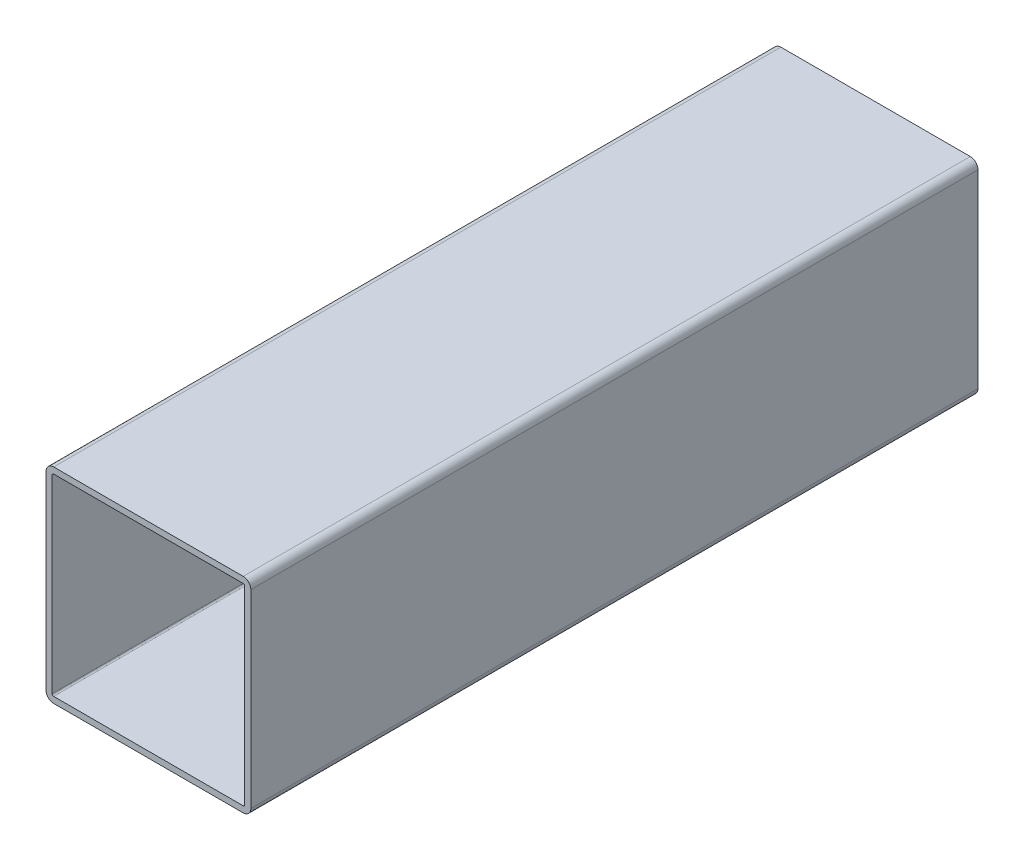
ISO-10303-21;
HEADER;
FILE_DESCRIPTION(('STEP AP214'),'2;1');
FILE_NAME('part.step','',(''),(''),'','','');
FILE_SCHEMA(('AUTOMOTIVE_DESIGN { 1 0 10303 214 1 1 1 1 }'));
ENDSEC;
DATA;
#1=APPLICATION_CONTEXT('core data for automotive mechanical design processes');
#2=APPLICATION_PROTOCOL_DEFINITION('international standard','automotive_design',2000,#1);
#3=PRODUCT_CONTEXT('',#1,'mechanical');
#4=PRODUCT('Part','Part','',(#3));
#5=PRODUCT_RELATED_PRODUCT_CATEGORY('part','',(#4));
#6=PRODUCT_DEFINITION_FORMATION('','',#4);
#7=PRODUCT_DEFINITION_CONTEXT('part definition',#1,'design');
#8=PRODUCT_DEFINITION('design','',#6,#7);
#9=PRODUCT_DEFINITION_SHAPE('','',#8);
#10=(LENGTH_UNIT() NAMED_UNIT(*) SI_UNIT(.MILLI.,.METRE.));
#11=(NAMED_UNIT(*) PLANE_ANGLE_UNIT() SI_UNIT($,.RADIAN.));
#12=(NAMED_UNIT(*) SI_UNIT($,.STERADIAN.) SOLID_ANGLE_UNIT());
#13=UNCERTAINTY_MEASURE_WITH_UNIT(LENGTH_MEASURE(1.E-05),#10,'distance_accuracy_value','');
#14=(GEOMETRIC_REPRESENTATION_CONTEXT(3) GLOBAL_UNCERTAINTY_ASSIGNED_CONTEXT((#13)) GLOBAL_UNIT_ASSIGNED_CONTEXT((#10,
#11,#12)) REPRESENTATION_CONTEXT('',''));
#15=CARTESIAN_POINT('',(0.,0.,0.));
#16=DIRECTION('',(0.,0.,1.));
#17=DIRECTION('',(1.,0.,0.));
#18=AXIS2_PLACEMENT_3D('',#15,#16,#17);
#19=CARTESIAN_POINT('',(-18.5,18.5,-142.));
#20=DIRECTION('',(0.,0.,1.));
#21=DIRECTION('',(1.,0.,0.));
#22=AXIS2_PLACEMENT_3D('',#19,#20,#21);
#23=CYLINDRICAL_SURFACE('',#22,1.5);
#24=CARTESIAN_POINT('',(-18.5,18.5,0.));
#25=DIRECTION('',(0.,0.,-1.));
#26=DIRECTION('',(-1.,0.,0.));
#27=AXIS2_PLACEMENT_3D('',#24,#25,#26);
#28=CIRCLE('',#27,1.5);
#29=CARTESIAN_POINT('',(-20.,18.5,0.));
#30=VERTEX_POINT('',#29);
#31=CARTESIAN_POINT('',(-18.5,20.,0.));
#32=VERTEX_POINT('',#31);
#33=EDGE_CURVE('E233',#30,#32,#28,.T.);
#34=ORIENTED_EDGE('',*,*,#33,.T.);
#35=DIRECTION('',(0.,0.,1.));
#36=VECTOR('',#35,1.);
#37=CARTESIAN_POINT('',(-18.5,20.,-142.));
#38=LINE('',#37,#36);
#39=CARTESIAN_POINT('',(-18.5,20.,-142.));
#40=VERTEX_POINT('',#39);
#41=EDGE_CURVE('E12',#40,#32,#38,.T.);
#42=ORIENTED_EDGE('',*,*,#41,.F.);
#43=CARTESIAN_POINT('',(-18.5,18.5,-142.));
#44=DIRECTION('',(0.,0.,-1.));
#45=DIRECTION('',(-1.,0.,0.));
#46=AXIS2_PLACEMENT_3D('',#43,#44,#45);
#47=CIRCLE('',#46,1.5);
#48=CARTESIAN_POINT('',(-20.,18.5,-142.));
#49=VERTEX_POINT('',#48);
#50=EDGE_CURVE('E311',#49,#40,#47,.T.);
#51=ORIENTED_EDGE('',*,*,#50,.F.);
#52=DIRECTION('',(0.,0.,1.));
#53=VECTOR('',#52,1.);
#54=CARTESIAN_POINT('',(-20.,18.5,-142.));
#55=LINE('',#54,#53);
#56=EDGE_CURVE('E248',#49,#30,#55,.T.);
#57=ORIENTED_EDGE('',*,*,#56,.T.);
#58=EDGE_LOOP('',(#34,#42,#51,#57));
#59=FACE_BOUND('',#58,.T.);
#60=ADVANCED_FACE('F61',(#59),#23,.T.);
#61=CARTESIAN_POINT('',(-18.5,20.,-142.));
#62=DIRECTION('',(0.,-1.,0.));
#63=DIRECTION('',(0.,0.,-1.));
#64=AXIS2_PLACEMENT_3D('',#61,#62,#63);
#65=PLANE('',#64);
#66=DIRECTION('',(1.,0.,0.));
#67=VECTOR('',#66,1.);
#68=CARTESIAN_POINT('',(-18.5,20.,0.));
#69=LINE('',#68,#67);
#70=CARTESIAN_POINT('',(18.5,20.,0.));
#71=VERTEX_POINT('',#70);
#72=EDGE_CURVE('E236',#32,#71,#69,.T.);
#73=ORIENTED_EDGE('',*,*,#72,.T.);
#74=DIRECTION('',(0.,0.,1.));
#75=VECTOR('',#74,1.);
#76=CARTESIAN_POINT('',(18.5,20.,-142.));
#77=LINE('',#76,#75);
#78=CARTESIAN_POINT('',(18.5,20.,-142.));
#79=VERTEX_POINT('',#78);
#80=EDGE_CURVE('E71',#79,#71,#77,.T.);
#81=ORIENTED_EDGE('',*,*,#80,.F.);
#82=DIRECTION('',(1.,0.,0.));
#83=VECTOR('',#82,1.);
#84=CARTESIAN_POINT('',(-18.5,20.,-142.));
#85=LINE('',#84,#83);
#86=EDGE_CURVE('E313',#40,#79,#85,.T.);
#87=ORIENTED_EDGE('',*,*,#86,.F.);
#88=ORIENTED_EDGE('',*,*,#41,.T.);
#89=EDGE_LOOP('',(#73,#81,#87,#88));
#90=FACE_BOUND('',#89,.T.);
#91=ADVANCED_FACE('F348',(#90),#65,.F.);
#92=CARTESIAN_POINT('',(18.5,18.5,-142.));
#93=DIRECTION('',(0.,0.,1.));
#94=DIRECTION('',(1.,0.,0.));
#95=AXIS2_PLACEMENT_3D('',#92,#93,#94);
#96=CYLINDRICAL_SURFACE('',#95,1.5);
#97=CARTESIAN_POINT('',(18.5,18.5,0.));
#98=DIRECTION('',(0.,0.,-1.));
#99=DIRECTION('',(-1.,0.,0.));
#100=AXIS2_PLACEMENT_3D('',#97,#98,#99);
#101=CIRCLE('',#100,1.5);
#102=CARTESIAN_POINT('',(20.,18.5,0.));
#103=VERTEX_POINT('',#102);
#104=EDGE_CURVE('E238',#71,#103,#101,.T.);
#105=ORIENTED_EDGE('',*,*,#104,.T.);
#106=DIRECTION('',(0.,0.,1.));
#107=VECTOR('',#106,1.);
#108=CARTESIAN_POINT('',(20.,18.5,-142.));
#109=LINE('',#108,#107);
#110=CARTESIAN_POINT('',(20.,18.5,-142.));
#111=VERTEX_POINT('',#110);
#112=EDGE_CURVE('E255',#111,#103,#109,.T.);
#113=ORIENTED_EDGE('',*,*,#112,.F.);
#114=CARTESIAN_POINT('',(18.5,18.5,-142.));
#115=DIRECTION('',(0.,0.,-1.));
#116=DIRECTION('',(-1.,0.,0.));
#117=AXIS2_PLACEMENT_3D('',#114,#115,#116);
#118=CIRCLE('',#117,1.5);
#119=EDGE_CURVE('E315',#79,#111,#118,.T.);
#120=ORIENTED_EDGE('',*,*,#119,.F.);
#121=ORIENTED_EDGE('',*,*,#80,.T.);
#122=EDGE_LOOP('',(#105,#113,#120,#121));
#123=FACE_BOUND('',#122,.T.);
#124=ADVANCED_FACE('F353',(#123),#96,.T.);
#125=CARTESIAN_POINT('',(20.,-18.5,-142.));
#126=DIRECTION('',(-1.,0.,0.));
#127=DIRECTION('',(0.,0.,1.));
#128=AXIS2_PLACEMENT_3D('',#125,#126,#127);
#129=PLANE('',#128);
#130=DIRECTION('',(0.,-1.,0.));
#131=VECTOR('',#130,1.);
#132=CARTESIAN_POINT('',(20.,-18.5,0.));
#133=LINE('',#132,#131);
#134=CARTESIAN_POINT('',(20.,-18.5,0.));
#135=VERTEX_POINT('',#134);
#136=EDGE_CURVE('E240',#103,#135,#133,.T.);
#137=ORIENTED_EDGE('',*,*,#136,.T.);
#138=DIRECTION('',(0.,0.,1.));
#139=VECTOR('',#138,1.);
#140=CARTESIAN_POINT('',(20.,-18.5,-142.));
#141=LINE('',#140,#139);
#142=CARTESIAN_POINT('',(20.,-18.5,-142.));
#143=VERTEX_POINT('',#142);
#144=EDGE_CURVE('E252',#143,#135,#141,.T.);
#145=ORIENTED_EDGE('',*,*,#144,.F.);
#146=DIRECTION('',(0.,-1.,0.));
#147=VECTOR('',#146,1.);
#148=CARTESIAN_POINT('',(20.,-18.5,-142.));
#149=LINE('',#148,#147);
#150=EDGE_CURVE('E317',#111,#143,#149,.T.);
#151=ORIENTED_EDGE('',*,*,#150,.F.);
#152=ORIENTED_EDGE('',*,*,#112,.T.);
#153=EDGE_LOOP('',(#137,#145,#151,#152));
#154=FACE_BOUND('',#153,.T.);
#155=ADVANCED_FACE('F323',(#154),#129,.F.);
#156=CARTESIAN_POINT('',(18.5,-18.5,-142.));
#157=DIRECTION('',(0.,0.,1.));
#158=DIRECTION('',(1.,0.,0.));
#159=AXIS2_PLACEMENT_3D('',#156,#157,#158);
#160=CYLINDRICAL_SURFACE('',#159,1.5);
#161=CARTESIAN_POINT('',(18.5,-18.5,0.));
#162=DIRECTION('',(0.,0.,-1.));
#163=DIRECTION('',(-1.,0.,0.));
#164=AXIS2_PLACEMENT_3D('',#161,#162,#163);
#165=CIRCLE('',#164,1.5);
#166=CARTESIAN_POINT('',(18.5,-20.,0.));
#167=VERTEX_POINT('',#166);
#168=EDGE_CURVE('E242',#135,#167,#165,.T.);
#169=ORIENTED_EDGE('',*,*,#168,.T.);
#170=DIRECTION('',(0.,0.,1.));
#171=VECTOR('',#170,1.);
#172=CARTESIAN_POINT('',(18.5,-20.,-142.));
#173=LINE('',#172,#171);
#174=CARTESIAN_POINT('',(18.5,-20.,-142.));
#175=VERTEX_POINT('',#174);
#176=EDGE_CURVE('E200',#175,#167,#173,.T.);
#177=ORIENTED_EDGE('',*,*,#176,.F.);
#178=CARTESIAN_POINT('',(18.5,-18.5,-142.));
#179=DIRECTION('',(0.,0.,-1.));
#180=DIRECTION('',(-1.,0.,0.));
#181=AXIS2_PLACEMENT_3D('',#178,#179,#180);
#182=CIRCLE('',#181,1.5);
#183=EDGE_CURVE('E191',#143,#175,#182,.T.);
#184=ORIENTED_EDGE('',*,*,#183,.F.);
#185=ORIENTED_EDGE('',*,*,#144,.T.);
#186=EDGE_LOOP('',(#169,#177,#184,#185));
#187=FACE_BOUND('',#186,.T.);
#188=ADVANCED_FACE('F327',(#187),#160,.T.);
#189=CARTESIAN_POINT('',(18.5,-20.,-142.));
#190=DIRECTION('',(0.,1.,0.));
#191=DIRECTION('',(0.,0.,1.));
#192=AXIS2_PLACEMENT_3D('',#189,#190,#191);
#193=PLANE('',#192);
#194=DIRECTION('',(-1.,0.,0.));
#195=VECTOR('',#194,1.);
#196=CARTESIAN_POINT('',(18.5,-20.,0.));
#197=LINE('',#196,#195);
#198=CARTESIAN_POINT('',(-18.5,-20.,0.));
#199=VERTEX_POINT('',#198);
#200=EDGE_CURVE('E199',#167,#199,#197,.T.);
#201=ORIENTED_EDGE('',*,*,#200,.T.);
#202=DIRECTION('',(0.,0.,1.));
#203=VECTOR('',#202,1.);
#204=CARTESIAN_POINT('',(-18.5,-20.,-142.));
#205=LINE('',#204,#203);
#206=CARTESIAN_POINT('',(-18.5,-20.,-142.));
#207=VERTEX_POINT('',#206);
#208=EDGE_CURVE('E196',#207,#199,#205,.T.);
#209=ORIENTED_EDGE('',*,*,#208,.F.);
#210=DIRECTION('',(-1.,0.,0.));
#211=VECTOR('',#210,1.);
#212=CARTESIAN_POINT('',(18.5,-20.,-142.));
#213=LINE('',#212,#211);
#214=EDGE_CURVE('E185',#175,#207,#213,.T.);
#215=ORIENTED_EDGE('',*,*,#214,.F.);
#216=ORIENTED_EDGE('',*,*,#176,.T.);
#217=EDGE_LOOP('',(#201,#209,#215,#216));
#218=FACE_BOUND('',#217,.T.);
#219=ADVANCED_FACE('F197',(#218),#193,.F.);
#220=CARTESIAN_POINT('',(-18.5,-18.5,-142.));
#221=DIRECTION('',(0.,0.,1.));
#222=DIRECTION('',(1.,0.,0.));
#223=AXIS2_PLACEMENT_3D('',#220,#221,#222);
#224=CYLINDRICAL_SURFACE('',#223,1.5);
#225=CARTESIAN_POINT('',(-18.5,-18.5,0.));
#226=DIRECTION('',(0.,0.,-1.));
#227=DIRECTION('',(-1.,0.,0.));
#228=AXIS2_PLACEMENT_3D('',#225,#226,#227);
#229=CIRCLE('',#228,1.5);
#230=CARTESIAN_POINT('',(-20.,-18.5,0.));
#231=VERTEX_POINT('',#230);
#232=EDGE_CURVE('E133',#199,#231,#229,.T.);
#233=ORIENTED_EDGE('',*,*,#232,.T.);
#234=DIRECTION('',(0.,0.,1.));
#235=VECTOR('',#234,1.);
#236=CARTESIAN_POINT('',(-20.,-18.5,-142.));
#237=LINE('',#236,#235);
#238=CARTESIAN_POINT('',(-20.,-18.5,-142.));
#239=VERTEX_POINT('',#238);
#240=EDGE_CURVE('E201',#239,#231,#237,.T.);
#241=ORIENTED_EDGE('',*,*,#240,.F.);
#242=CARTESIAN_POINT('',(-18.5,-18.5,-142.));
#243=DIRECTION('',(0.,0.,-1.));
#244=DIRECTION('',(-1.,0.,0.));
#245=AXIS2_PLACEMENT_3D('',#242,#243,#244);
#246=CIRCLE('',#245,1.5);
#247=EDGE_CURVE('E189',#207,#239,#246,.T.);
#248=ORIENTED_EDGE('',*,*,#247,.F.);
#249=ORIENTED_EDGE('',*,*,#208,.T.);
#250=EDGE_LOOP('',(#233,#241,#248,#249));
#251=FACE_BOUND('',#250,.T.);
#252=ADVANCED_FACE('F203',(#251),#224,.T.);
#253=CARTESIAN_POINT('',(18.5,18.5,-142.));
#254=DIRECTION('',(0.,0.,1.));
#255=DIRECTION('',(1.,0.,0.));
#256=AXIS2_PLACEMENT_3D('',#253,#254,#255);
#257=CYLINDRICAL_SURFACE('',#256,0.3);
#258=CARTESIAN_POINT('',(18.5,18.5,0.));
#259=DIRECTION('',(0.,0.,-1.));
#260=DIRECTION('',(-1.,0.,0.));
#261=AXIS2_PLACEMENT_3D('',#258,#259,#260);
#262=CIRCLE('',#261,0.3);
#263=CARTESIAN_POINT('',(18.5,18.8,0.));
#264=VERTEX_POINT('',#263);
#265=CARTESIAN_POINT('',(18.8,18.5,0.));
#266=VERTEX_POINT('',#265);
#267=EDGE_CURVE('E209',#264,#266,#262,.T.);
#268=ORIENTED_EDGE('',*,*,#267,.F.);
#269=DIRECTION('',(0.,0.,1.));
#270=VECTOR('',#269,1.);
#271=CARTESIAN_POINT('',(18.5,18.8,-142.));
#272=LINE('',#271,#270);
#273=CARTESIAN_POINT('',(18.5,18.8,-142.));
#274=VERTEX_POINT('',#273);
#275=EDGE_CURVE('E65',#274,#264,#272,.T.);
#276=ORIENTED_EDGE('',*,*,#275,.F.);
#277=CARTESIAN_POINT('',(18.5,18.5,-142.));
#278=DIRECTION('',(0.,0.,-1.));
#279=DIRECTION('',(-1.,0.,0.));
#280=AXIS2_PLACEMENT_3D('',#277,#278,#279);
#281=CIRCLE('',#280,0.3);
#282=CARTESIAN_POINT('',(18.8,18.5,-142.));
#283=VERTEX_POINT('',#282);
#284=EDGE_CURVE('E247',#274,#283,#281,.T.);
#285=ORIENTED_EDGE('',*,*,#284,.T.);
#286=DIRECTION('',(0.,0.,1.));
#287=VECTOR('',#286,1.);
#288=CARTESIAN_POINT('',(18.8,18.5,-142.));
#289=LINE('',#288,#287);
#290=EDGE_CURVE('E205',#283,#266,#289,.T.);
#291=ORIENTED_EDGE('',*,*,#290,.T.);
#292=EDGE_LOOP('',(#268,#276,#285,#291));
#293=FACE_BOUND('',#292,.T.);
#294=ADVANCED_FACE('F63',(#293),#257,.F.);
#295=CARTESIAN_POINT('',(-18.5,18.8,-142.));
#296=DIRECTION('',(0.,-1.,0.));
#297=DIRECTION('',(0.,0.,-1.));
#298=AXIS2_PLACEMENT_3D('',#295,#296,#297);
#299=PLANE('',#298);
#300=DIRECTION('',(1.,0.,0.));
#301=VECTOR('',#300,1.);
#302=CARTESIAN_POINT('',(-18.5,18.8,0.));
#303=LINE('',#302,#301);
#304=CARTESIAN_POINT('',(-18.5,18.8,0.));
#305=VERTEX_POINT('',#304);
#306=EDGE_CURVE('E212',#305,#264,#303,.T.);
#307=ORIENTED_EDGE('',*,*,#306,.F.);
#308=DIRECTION('',(0.,0.,1.));
#309=VECTOR('',#308,1.);
#310=CARTESIAN_POINT('',(-18.5,18.8,-142.));
#311=LINE('',#310,#309);
#312=CARTESIAN_POINT('',(-18.5,18.8,-142.));
#313=VERTEX_POINT('',#312);
#314=EDGE_CURVE('E270',#313,#305,#311,.T.);
#315=ORIENTED_EDGE('',*,*,#314,.F.);
#316=DIRECTION('',(1.,0.,0.));
#317=VECTOR('',#316,1.);
#318=CARTESIAN_POINT('',(-18.5,18.8,-142.));
#319=LINE('',#318,#317);
#320=EDGE_CURVE('E279',#313,#274,#319,.T.);
#321=ORIENTED_EDGE('',*,*,#320,.T.);
#322=ORIENTED_EDGE('',*,*,#275,.T.);
#323=EDGE_LOOP('',(#307,#315,#321,#322));
#324=FACE_BOUND('',#323,.T.);
#325=ADVANCED_FACE('F277',(#324),#299,.T.);
#326=CARTESIAN_POINT('',(-18.5,18.5,-142.));
#327=DIRECTION('',(0.,0.,1.));
#328=DIRECTION('',(1.,0.,0.));
#329=AXIS2_PLACEMENT_3D('',#326,#327,#328);
#330=CYLINDRICAL_SURFACE('',#329,0.3);
#331=CARTESIAN_POINT('',(-18.5,18.5,0.));
#332=DIRECTION('',(0.,0.,-1.));
#333=DIRECTION('',(-1.,0.,0.));
#334=AXIS2_PLACEMENT_3D('',#331,#332,#333);
#335=CIRCLE('',#334,0.3);
#336=CARTESIAN_POINT('',(-18.8,18.5,0.));
#337=VERTEX_POINT('',#336);
#338=EDGE_CURVE('E215',#337,#305,#335,.T.);
#339=ORIENTED_EDGE('',*,*,#338,.F.);
#340=DIRECTION('',(0.,0.,1.));
#341=VECTOR('',#340,1.);
#342=CARTESIAN_POINT('',(-18.8,18.5,-142.));
#343=LINE('',#342,#341);
#344=CARTESIAN_POINT('',(-18.8,18.5,-142.));
#345=VERTEX_POINT('',#344);
#346=EDGE_CURVE('E269',#345,#337,#343,.T.);
#347=ORIENTED_EDGE('',*,*,#346,.F.);
#348=CARTESIAN_POINT('',(-18.5,18.5,-142.));
#349=DIRECTION('',(0.,0.,-1.));
#350=DIRECTION('',(-1.,0.,0.));
#351=AXIS2_PLACEMENT_3D('',#348,#349,#350);
#352=CIRCLE('',#351,0.3);
#353=EDGE_CURVE('E287',#345,#313,#352,.T.);
#354=ORIENTED_EDGE('',*,*,#353,.T.);
#355=ORIENTED_EDGE('',*,*,#314,.T.);
#356=EDGE_LOOP('',(#339,#347,#354,#355));
#357=FACE_BOUND('',#356,.T.);
#358=ADVANCED_FACE('F285',(#357),#330,.F.);
#359=CARTESIAN_POINT('',(-18.8,18.5,-142.));
#360=DIRECTION('',(1.,0.,0.));
#361=DIRECTION('',(0.,0.,-1.));
#362=AXIS2_PLACEMENT_3D('',#359,#360,#361);
#363=PLANE('',#362);
#364=DIRECTION('',(0.,1.,0.));
#365=VECTOR('',#364,1.);
#366=CARTESIAN_POINT('',(-18.8,18.5,0.));
#367=LINE('',#366,#365);
#368=CARTESIAN_POINT('',(-18.8,-18.5,0.));
#369=VERTEX_POINT('',#368);
#370=EDGE_CURVE('E218',#369,#337,#367,.T.);
#371=ORIENTED_EDGE('',*,*,#370,.F.);
#372=DIRECTION('',(0.,0.,1.));
#373=VECTOR('',#372,1.);
#374=CARTESIAN_POINT('',(-18.8,-18.5,-142.));
#375=LINE('',#374,#373);
#376=CARTESIAN_POINT('',(-18.8,-18.5,-142.));
#377=VERTEX_POINT('',#376);
#378=EDGE_CURVE('E267',#377,#369,#375,.T.);
#379=ORIENTED_EDGE('',*,*,#378,.F.);
#380=DIRECTION('',(0.,1.,0.));
#381=VECTOR('',#380,1.);
#382=CARTESIAN_POINT('',(-18.8,18.5,-142.));
#383=LINE('',#382,#381);
#384=EDGE_CURVE('E293',#377,#345,#383,.T.);
#385=ORIENTED_EDGE('',*,*,#384,.T.);
#386=ORIENTED_EDGE('',*,*,#346,.T.);
#387=EDGE_LOOP('',(#371,#379,#385,#386));
#388=FACE_BOUND('',#387,.T.);
#389=ADVANCED_FACE('F296',(#388),#363,.T.);
#390=CARTESIAN_POINT('',(-18.5,-18.5,-142.));
#391=DIRECTION('',(0.,0.,1.));
#392=DIRECTION('',(1.,0.,0.));
#393=AXIS2_PLACEMENT_3D('',#390,#391,#392);
#394=CYLINDRICAL_SURFACE('',#393,0.300000000000005);
#395=CARTESIAN_POINT('',(-18.5,-18.5,0.));
#396=DIRECTION('',(0.,0.,-1.));
#397=DIRECTION('',(-1.,0.,0.));
#398=AXIS2_PLACEMENT_3D('',#395,#396,#397);
#399=CIRCLE('',#398,0.300000000000005);
#400=CARTESIAN_POINT('',(-18.5,-18.8,0.));
#401=VERTEX_POINT('',#400);
#402=EDGE_CURVE('E221',#401,#369,#399,.T.);
#403=ORIENTED_EDGE('',*,*,#402,.F.);
#404=DIRECTION('',(0.,0.,1.));
#405=VECTOR('',#404,1.);
#406=CARTESIAN_POINT('',(-18.5,-18.8,-142.));
#407=LINE('',#406,#405);
#408=CARTESIAN_POINT('',(-18.5,-18.8,-142.));
#409=VERTEX_POINT('',#408);
#410=EDGE_CURVE('E265',#409,#401,#407,.T.);
#411=ORIENTED_EDGE('',*,*,#410,.F.);
#412=CARTESIAN_POINT('',(-18.5,-18.5,-142.));
#413=DIRECTION('',(0.,0.,-1.));
#414=DIRECTION('',(-1.,0.,0.));
#415=AXIS2_PLACEMENT_3D('',#412,#413,#414);
#416=CIRCLE('',#415,0.300000000000005);
#417=EDGE_CURVE('E297',#409,#377,#416,.T.);
#418=ORIENTED_EDGE('',*,*,#417,.T.);
#419=ORIENTED_EDGE('',*,*,#378,.T.);
#420=EDGE_LOOP('',(#403,#411,#418,#419));
#421=FACE_BOUND('',#420,.T.);
#422=ADVANCED_FACE('F364',(#421),#394,.F.);
#423=CARTESIAN_POINT('',(18.5,-18.8,-142.));
#424=DIRECTION('',(0.,1.,0.));
#425=DIRECTION('',(0.,0.,1.));
#426=AXIS2_PLACEMENT_3D('',#423,#424,#425);
#427=PLANE('',#426);
#428=DIRECTION('',(-1.,0.,0.));
#429=VECTOR('',#428,1.);
#430=CARTESIAN_POINT('',(18.5,-18.8,0.));
#431=LINE('',#430,#429);
#432=CARTESIAN_POINT('',(18.5,-18.8,0.));
#433=VERTEX_POINT('',#432);
#434=EDGE_CURVE('E224',#433,#401,#431,.T.);
#435=ORIENTED_EDGE('',*,*,#434,.F.);
#436=DIRECTION('',(0.,0.,1.));
#437=VECTOR('',#436,1.);
#438=CARTESIAN_POINT('',(18.5,-18.8,-142.));
#439=LINE('',#438,#437);
#440=CARTESIAN_POINT('',(18.5,-18.8,-142.));
#441=VERTEX_POINT('',#440);
#442=EDGE_CURVE('E263',#441,#433,#439,.T.);
#443=ORIENTED_EDGE('',*,*,#442,.F.);
#444=DIRECTION('',(-1.,0.,0.));
#445=VECTOR('',#444,1.);
#446=CARTESIAN_POINT('',(18.5,-18.8,-142.));
#447=LINE('',#446,#445);
#448=EDGE_CURVE('E299',#441,#409,#447,.T.);
#449=ORIENTED_EDGE('',*,*,#448,.T.);
#450=ORIENTED_EDGE('',*,*,#410,.T.);
#451=EDGE_LOOP('',(#435,#443,#449,#450));
#452=FACE_BOUND('',#451,.T.);
#453=ADVANCED_FACE('F360',(#452),#427,.T.);
#454=CARTESIAN_POINT('',(18.5,-18.5,-142.));
#455=DIRECTION('',(0.,0.,1.));
#456=DIRECTION('',(1.,0.,0.));
#457=AXIS2_PLACEMENT_3D('',#454,#455,#456);
#458=CYLINDRICAL_SURFACE('',#457,0.300000000000003);
#459=CARTESIAN_POINT('',(18.5,-18.5,0.));
#460=DIRECTION('',(0.,0.,-1.));
#461=DIRECTION('',(-1.,0.,0.));
#462=AXIS2_PLACEMENT_3D('',#459,#460,#461);
#463=CIRCLE('',#462,0.300000000000003);
#464=CARTESIAN_POINT('',(18.8,-18.5,0.));
#465=VERTEX_POINT('',#464);
#466=EDGE_CURVE('E227',#465,#433,#463,.T.);
#467=ORIENTED_EDGE('',*,*,#466,.F.);
#468=DIRECTION('',(0.,0.,1.));
#469=VECTOR('',#468,1.);
#470=CARTESIAN_POINT('',(18.8,-18.5,-142.));
#471=LINE('',#470,#469);
#472=CARTESIAN_POINT('',(18.8,-18.5,-142.));
#473=VERTEX_POINT('',#472);
#474=EDGE_CURVE('E261',#473,#465,#471,.T.);
#475=ORIENTED_EDGE('',*,*,#474,.F.);
#476=CARTESIAN_POINT('',(18.5,-18.5,-142.));
#477=DIRECTION('',(0.,0.,-1.));
#478=DIRECTION('',(-1.,0.,0.));
#479=AXIS2_PLACEMENT_3D('',#476,#477,#478);
#480=CIRCLE('',#479,0.300000000000003);
#481=EDGE_CURVE('E305',#473,#441,#480,.T.);
#482=ORIENTED_EDGE('',*,*,#481,.T.);
#483=ORIENTED_EDGE('',*,*,#442,.T.);
#484=EDGE_LOOP('',(#467,#475,#482,#483));
#485=FACE_BOUND('',#484,.T.);
#486=ADVANCED_FACE('F342',(#485),#458,.F.);
#487=CARTESIAN_POINT('',(18.8,-18.5,-142.));
#488=DIRECTION('',(-1.,0.,0.));
#489=DIRECTION('',(0.,0.,1.));
#490=AXIS2_PLACEMENT_3D('',#487,#488,#489);
#491=PLANE('',#490);
#492=DIRECTION('',(0.,-1.,0.));
#493=VECTOR('',#492,1.);
#494=CARTESIAN_POINT('',(18.8,-18.5,0.));
#495=LINE('',#494,#493);
#496=EDGE_CURVE('E230',#266,#465,#495,.T.);
#497=ORIENTED_EDGE('',*,*,#496,.F.);
#498=ORIENTED_EDGE('',*,*,#290,.F.);
#499=DIRECTION('',(0.,-1.,0.));
#500=VECTOR('',#499,1.);
#501=CARTESIAN_POINT('',(18.8,-18.5,-142.));
#502=LINE('',#501,#500);
#503=EDGE_CURVE('E308',#283,#473,#502,.T.);
#504=ORIENTED_EDGE('',*,*,#503,.T.);
#505=ORIENTED_EDGE('',*,*,#474,.T.);
#506=EDGE_LOOP('',(#497,#498,#504,#505));
#507=FACE_BOUND('',#506,.T.);
#508=ADVANCED_FACE('F335',(#507),#491,.T.);
#509=CARTESIAN_POINT('',(-20.,18.5,-142.));
#510=DIRECTION('',(1.,0.,0.));
#511=DIRECTION('',(0.,0.,-1.));
#512=AXIS2_PLACEMENT_3D('',#509,#510,#511);
#513=PLANE('',#512);
#514=DIRECTION('',(0.,1.,0.));
#515=VECTOR('',#514,1.);
#516=CARTESIAN_POINT('',(-20.,18.5,0.));
#517=LINE('',#516,#515);
#518=EDGE_CURVE('E139',#231,#30,#517,.T.);
#519=ORIENTED_EDGE('',*,*,#518,.T.);
#520=ORIENTED_EDGE('',*,*,#56,.F.);
#521=DIRECTION('',(0.,1.,0.));
#522=VECTOR('',#521,1.);
#523=CARTESIAN_POINT('',(-20.,18.5,-142.));
#524=LINE('',#523,#522);
#525=EDGE_CURVE('E80',#239,#49,#524,.T.);
#526=ORIENTED_EDGE('',*,*,#525,.F.);
#527=ORIENTED_EDGE('',*,*,#240,.T.);
#528=EDGE_LOOP('',(#519,#520,#526,#527));
#529=FACE_BOUND('',#528,.T.);
#530=ADVANCED_FACE('F333',(#529),#513,.F.);
#531=CARTESIAN_POINT('',(-18.5,18.5,-142.));
#532=DIRECTION('',(0.,0.,-1.));
#533=DIRECTION('',(-1.,0.,0.));
#534=AXIS2_PLACEMENT_3D('',#531,#532,#533);
#535=PLANE('',#534);
#536=ORIENTED_EDGE('',*,*,#284,.F.);
#537=ORIENTED_EDGE('',*,*,#320,.F.);
#538=ORIENTED_EDGE('',*,*,#353,.F.);
#539=ORIENTED_EDGE('',*,*,#384,.F.);
#540=ORIENTED_EDGE('',*,*,#417,.F.);
#541=ORIENTED_EDGE('',*,*,#448,.F.);
#542=ORIENTED_EDGE('',*,*,#481,.F.);
#543=ORIENTED_EDGE('',*,*,#503,.F.);
#544=EDGE_LOOP('',(#536,#537,#538,#539,#540,#541,#542,#543));
#545=FACE_BOUND('',#544,.T.);
#546=ORIENTED_EDGE('',*,*,#50,.T.);
#547=ORIENTED_EDGE('',*,*,#86,.T.);
#548=ORIENTED_EDGE('',*,*,#119,.T.);
#549=ORIENTED_EDGE('',*,*,#150,.T.);
#550=ORIENTED_EDGE('',*,*,#183,.T.);
#551=ORIENTED_EDGE('',*,*,#214,.T.);
#552=ORIENTED_EDGE('',*,*,#247,.T.);
#553=ORIENTED_EDGE('',*,*,#525,.T.);
#554=EDGE_LOOP('',(#546,#547,#548,#549,#550,#551,#552,#553));
#555=FACE_BOUND('',#554,.T.);
#556=ADVANCED_FACE('F187',(#545,#555),#535,.T.);
#557=CARTESIAN_POINT('',(-18.5,18.5,0.));
#558=DIRECTION('',(0.,0.,-1.));
#559=DIRECTION('',(-1.,0.,0.));
#560=AXIS2_PLACEMENT_3D('',#557,#558,#559);
#561=PLANE('',#560);
#562=ORIENTED_EDGE('',*,*,#267,.T.);
#563=ORIENTED_EDGE('',*,*,#496,.T.);
#564=ORIENTED_EDGE('',*,*,#466,.T.);
#565=ORIENTED_EDGE('',*,*,#434,.T.);
#566=ORIENTED_EDGE('',*,*,#402,.T.);
#567=ORIENTED_EDGE('',*,*,#370,.T.);
#568=ORIENTED_EDGE('',*,*,#338,.T.);
#569=ORIENTED_EDGE('',*,*,#306,.T.);
#570=EDGE_LOOP('',(#562,#563,#564,#565,#566,#567,#568,#569));
#571=FACE_BOUND('',#570,.T.);
#572=ORIENTED_EDGE('',*,*,#33,.F.);
#573=ORIENTED_EDGE('',*,*,#518,.F.);
#574=ORIENTED_EDGE('',*,*,#232,.F.);
#575=ORIENTED_EDGE('',*,*,#200,.F.);
#576=ORIENTED_EDGE('',*,*,#168,.F.);
#577=ORIENTED_EDGE('',*,*,#136,.F.);
#578=ORIENTED_EDGE('',*,*,#104,.F.);
#579=ORIENTED_EDGE('',*,*,#72,.F.);
#580=EDGE_LOOP('',(#572,#573,#574,#575,#576,#577,#578,#579));
#581=FACE_BOUND('',#580,.T.);
#582=ADVANCED_FACE('F282',(#571,#581),#561,.F.);
#583=CLOSED_SHELL('',(#60,#91,#124,#155,#188,#219,#252,#294,#325,#358,#389,#422,#453,#486,#508,
#530,#556,#582));
#584=MANIFOLD_SOLID_BREP('B2',#583);
#585=ADVANCED_BREP_SHAPE_REPRESENTATION('',(#18,#584),#14);
#586=SHAPE_DEFINITION_REPRESENTATION(#9,#585);
ENDSEC;
END-ISO-10303-21;
